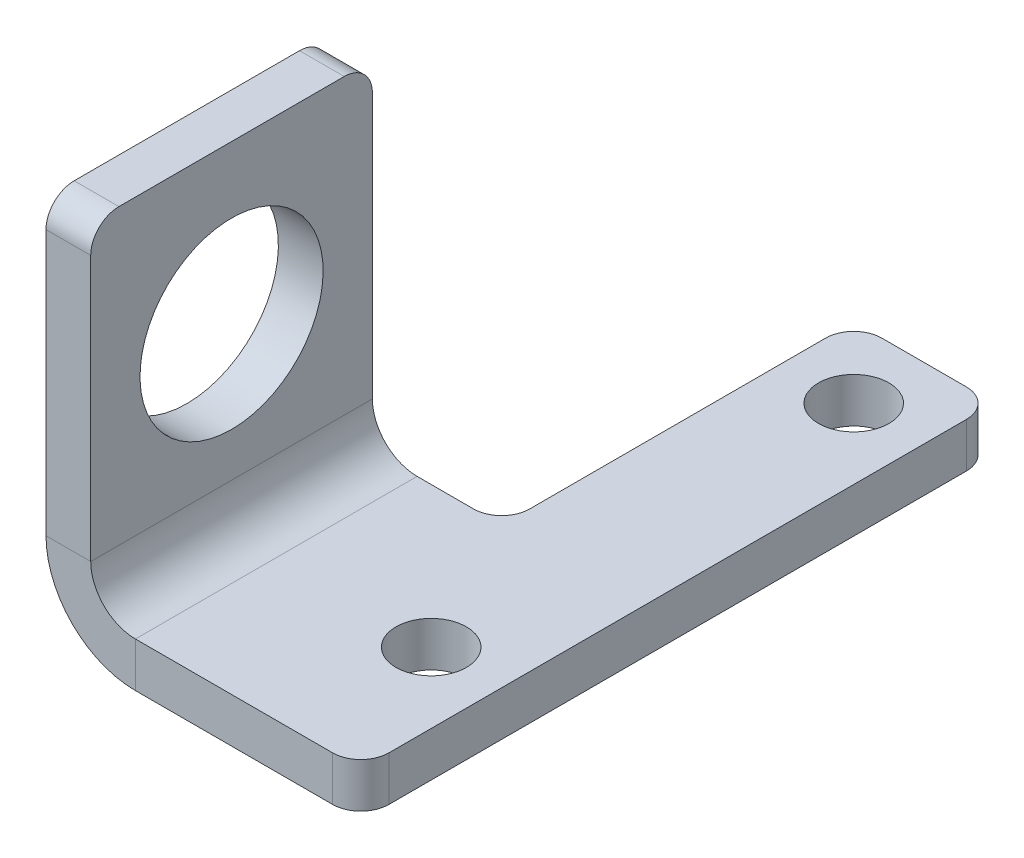
ISO-10303-21;
HEADER;
FILE_DESCRIPTION(('STEP AP214'),'2;1');
FILE_NAME('part.step','',(''),(''),'','','');
FILE_SCHEMA(('AUTOMOTIVE_DESIGN { 1 0 10303 214 1 1 1 1 }'));
ENDSEC;
DATA;
#1=APPLICATION_CONTEXT('core data for automotive mechanical design processes');
#2=APPLICATION_PROTOCOL_DEFINITION('international standard','automotive_design',2000,#1);
#3=PRODUCT_CONTEXT('',#1,'mechanical');
#4=PRODUCT('Part','Part','',(#3));
#5=PRODUCT_RELATED_PRODUCT_CATEGORY('part','',(#4));
#6=PRODUCT_DEFINITION_FORMATION('','',#4);
#7=PRODUCT_DEFINITION_CONTEXT('part definition',#1,'design');
#8=PRODUCT_DEFINITION('design','',#6,#7);
#9=PRODUCT_DEFINITION_SHAPE('','',#8);
#10=(LENGTH_UNIT() NAMED_UNIT(*) SI_UNIT(.MILLI.,.METRE.));
#11=(NAMED_UNIT(*) PLANE_ANGLE_UNIT() SI_UNIT($,.RADIAN.));
#12=(NAMED_UNIT(*) SI_UNIT($,.STERADIAN.) SOLID_ANGLE_UNIT());
#13=UNCERTAINTY_MEASURE_WITH_UNIT(LENGTH_MEASURE(1.E-05),#10,'distance_accuracy_value','');
#14=(GEOMETRIC_REPRESENTATION_CONTEXT(3) GLOBAL_UNCERTAINTY_ASSIGNED_CONTEXT((#13)) GLOBAL_UNIT_ASSIGNED_CONTEXT((#10,
#11,#12)) REPRESENTATION_CONTEXT('',''));
#15=CARTESIAN_POINT('',(0.,0.,0.));
#16=DIRECTION('',(0.,0.,1.));
#17=DIRECTION('',(1.,0.,0.));
#18=AXIS2_PLACEMENT_3D('',#15,#16,#17);
#19=CARTESIAN_POINT('',(-10.,3.175,0.));
#20=DIRECTION('',(1.,0.,0.));
#21=DIRECTION('',(0.,0.,-1.));
#22=AXIS2_PLACEMENT_3D('',#19,#20,#21);
#23=PLANE('',#22);
#24=DIRECTION('',(0.,0.,-1.));
#25=VECTOR('',#24,1.);
#26=CARTESIAN_POINT('',(-10.,0.,0.));
#27=LINE('',#26,#25);
#28=CARTESIAN_POINT('',(-10.,0.,-22.));
#29=VERTEX_POINT('',#28);
#30=CARTESIAN_POINT('',(-10.,0.,-43.));
#31=VERTEX_POINT('',#30);
#32=EDGE_CURVE('E249',#29,#31,#27,.T.);
#33=ORIENTED_EDGE('',*,*,#32,.F.);
#34=DIRECTION('',(0.,-1.,0.));
#35=VECTOR('',#34,1.);
#36=CARTESIAN_POINT('',(-10.,0.,-22.));
#37=LINE('',#36,#35);
#38=CARTESIAN_POINT('',(-10.,3.175,-22.));
#39=VERTEX_POINT('',#38);
#40=EDGE_CURVE('E277',#39,#29,#37,.T.);
#41=ORIENTED_EDGE('',*,*,#40,.F.);
#42=DIRECTION('',(0.,0.,-1.));
#43=VECTOR('',#42,1.);
#44=CARTESIAN_POINT('',(-10.,3.175,0.));
#45=LINE('',#44,#43);
#46=CARTESIAN_POINT('',(-10.,3.175,-43.));
#47=VERTEX_POINT('',#46);
#48=EDGE_CURVE('E231',#39,#47,#45,.T.);
#49=ORIENTED_EDGE('',*,*,#48,.T.);
#50=DIRECTION('',(0.,-1.,0.));
#51=VECTOR('',#50,1.);
#52=CARTESIAN_POINT('',(-10.,3.175,-43.));
#53=LINE('',#52,#51);
#54=EDGE_CURVE('E280',#31,#47,#53,.F.);
#55=ORIENTED_EDGE('',*,*,#54,.F.);
#56=EDGE_LOOP('',(#33,#41,#49,#55));
#57=FACE_BOUND('',#56,.T.);
#58=ADVANCED_FACE('F45',(#57),#23,.F.);
#59=CARTESIAN_POINT('',(0.,3.175,-45.));
#60=DIRECTION('',(0.,0.,1.));
#61=DIRECTION('',(1.,0.,0.));
#62=AXIS2_PLACEMENT_3D('',#59,#60,#61);
#63=PLANE('',#62);
#64=DIRECTION('',(-1.,0.,0.));
#65=VECTOR('',#64,1.);
#66=CARTESIAN_POINT('',(0.,0.,-45.));
#67=LINE('',#66,#65);
#68=CARTESIAN_POINT('',(-8.,0.,-45.));
#69=VERTEX_POINT('',#68);
#70=CARTESIAN_POINT('',(-2.,0.,-45.));
#71=VERTEX_POINT('',#70);
#72=EDGE_CURVE('E222',#69,#71,#67,.F.);
#73=ORIENTED_EDGE('',*,*,#72,.F.);
#74=DIRECTION('',(0.,-1.,0.));
#75=VECTOR('',#74,1.);
#76=CARTESIAN_POINT('',(-8.,3.175,-45.));
#77=LINE('',#76,#75);
#78=CARTESIAN_POINT('',(-8.,3.175,-45.));
#79=VERTEX_POINT('',#78);
#80=EDGE_CURVE('E237',#79,#69,#77,.T.);
#81=ORIENTED_EDGE('',*,*,#80,.F.);
#82=DIRECTION('',(1.,0.,0.));
#83=VECTOR('',#82,1.);
#84=CARTESIAN_POINT('',(0.,3.175,-45.));
#85=LINE('',#84,#83);
#86=CARTESIAN_POINT('',(-2.,3.175,-45.));
#87=VERTEX_POINT('',#86);
#88=EDGE_CURVE('E234',#79,#87,#85,.T.);
#89=ORIENTED_EDGE('',*,*,#88,.T.);
#90=DIRECTION('',(0.,-1.,0.));
#91=VECTOR('',#90,1.);
#92=CARTESIAN_POINT('',(-2.,3.175,-45.));
#93=LINE('',#92,#91);
#94=EDGE_CURVE('E256',#71,#87,#93,.F.);
#95=ORIENTED_EDGE('',*,*,#94,.F.);
#96=EDGE_LOOP('',(#73,#81,#89,#95));
#97=FACE_BOUND('',#96,.T.);
#98=ADVANCED_FACE('F327',(#97),#63,.F.);
#99=CARTESIAN_POINT('',(0.,3.175,0.));
#100=DIRECTION('',(-1.,0.,0.));
#101=DIRECTION('',(0.,0.,1.));
#102=AXIS2_PLACEMENT_3D('',#99,#100,#101);
#103=PLANE('',#102);
#104=DIRECTION('',(0.,0.,1.));
#105=VECTOR('',#104,1.);
#106=CARTESIAN_POINT('',(0.,3.175,0.));
#107=LINE('',#106,#105);
#108=CARTESIAN_POINT('',(0.,3.175,-43.));
#109=VERTEX_POINT('',#108);
#110=CARTESIAN_POINT('',(0.,3.175,-2.));
#111=VERTEX_POINT('',#110);
#112=EDGE_CURVE('E225',#109,#111,#107,.T.);
#113=ORIENTED_EDGE('',*,*,#112,.T.);
#114=DIRECTION('',(0.,-1.,0.));
#115=VECTOR('',#114,1.);
#116=CARTESIAN_POINT('',(0.,3.175,-2.));
#117=LINE('',#116,#115);
#118=CARTESIAN_POINT('',(0.,0.,-2.));
#119=VERTEX_POINT('',#118);
#120=EDGE_CURVE('E265',#119,#111,#117,.F.);
#121=ORIENTED_EDGE('',*,*,#120,.F.);
#122=DIRECTION('',(0.,0.,-1.));
#123=VECTOR('',#122,1.);
#124=CARTESIAN_POINT('',(0.,0.,0.));
#125=LINE('',#124,#123);
#126=CARTESIAN_POINT('',(0.,0.,-43.));
#127=VERTEX_POINT('',#126);
#128=EDGE_CURVE('E243',#127,#119,#125,.F.);
#129=ORIENTED_EDGE('',*,*,#128,.F.);
#130=DIRECTION('',(0.,-1.,0.));
#131=VECTOR('',#130,1.);
#132=CARTESIAN_POINT('',(0.,3.175,-43.));
#133=LINE('',#132,#131);
#134=EDGE_CURVE('E268',#109,#127,#133,.T.);
#135=ORIENTED_EDGE('',*,*,#134,.F.);
#136=EDGE_LOOP('',(#113,#121,#129,#135));
#137=FACE_BOUND('',#136,.T.);
#138=ADVANCED_FACE('F334',(#137),#103,.F.);
#139=CARTESIAN_POINT('',(-5.,3.175,-10.));
#140=DIRECTION('',(0.,-1.,0.));
#141=DIRECTION('',(0.,0.,-1.));
#142=AXIS2_PLACEMENT_3D('',#139,#140,#141);
#143=CYLINDRICAL_SURFACE('',#142,2.5);
#144=CARTESIAN_POINT('',(-5.,3.175,-10.));
#145=DIRECTION('',(0.,-1.,0.));
#146=DIRECTION('',(0.,0.,1.));
#147=AXIS2_PLACEMENT_3D('',#144,#145,#146);
#148=CIRCLE('',#147,2.5);
#149=CARTESIAN_POINT('',(-5.,3.175,-7.5));
#150=VERTEX_POINT('',#149);
#151=EDGE_CURVE('E218',#150,#150,#148,.T.);
#152=ORIENTED_EDGE('',*,*,#151,.F.);
#153=EDGE_LOOP('',(#152));
#154=FACE_BOUND('',#153,.T.);
#155=CARTESIAN_POINT('',(-5.,0.,-10.));
#156=DIRECTION('',(0.,-1.,0.));
#157=DIRECTION('',(0.,0.,1.));
#158=AXIS2_PLACEMENT_3D('',#155,#156,#157);
#159=CIRCLE('',#158,2.5);
#160=CARTESIAN_POINT('',(-5.,0.,-7.5));
#161=VERTEX_POINT('',#160);
#162=EDGE_CURVE('E217',#161,#161,#159,.T.);
#163=ORIENTED_EDGE('',*,*,#162,.T.);
#164=EDGE_LOOP('',(#163));
#165=FACE_BOUND('',#164,.T.);
#166=ADVANCED_FACE('F575',(#154,#165),#143,.F.);
#167=CARTESIAN_POINT('',(-5.,3.175,-40.));
#168=DIRECTION('',(0.,-1.,0.));
#169=DIRECTION('',(0.,0.,-1.));
#170=AXIS2_PLACEMENT_3D('',#167,#168,#169);
#171=CYLINDRICAL_SURFACE('',#170,2.5);
#172=CARTESIAN_POINT('',(-5.,3.175,-40.));
#173=DIRECTION('',(0.,-1.,0.));
#174=DIRECTION('',(0.,0.,1.));
#175=AXIS2_PLACEMENT_3D('',#172,#173,#174);
#176=CIRCLE('',#175,2.5);
#177=CARTESIAN_POINT('',(-5.,3.175,-37.5));
#178=VERTEX_POINT('',#177);
#179=EDGE_CURVE('E221',#178,#178,#176,.T.);
#180=ORIENTED_EDGE('',*,*,#179,.F.);
#181=EDGE_LOOP('',(#180));
#182=FACE_BOUND('',#181,.T.);
#183=CARTESIAN_POINT('',(-5.,0.,-40.));
#184=DIRECTION('',(0.,-1.,0.));
#185=DIRECTION('',(0.,0.,1.));
#186=AXIS2_PLACEMENT_3D('',#183,#184,#185);
#187=CIRCLE('',#186,2.5);
#188=CARTESIAN_POINT('',(-5.,0.,-37.5));
#189=VERTEX_POINT('',#188);
#190=EDGE_CURVE('E240',#189,#189,#187,.T.);
#191=ORIENTED_EDGE('',*,*,#190,.T.);
#192=EDGE_LOOP('',(#191));
#193=FACE_BOUND('',#192,.T.);
#194=ADVANCED_FACE('F396',(#182,#193),#171,.F.);
#195=CARTESIAN_POINT('',(0.,3.175,0.));
#196=DIRECTION('',(0.,0.,-1.));
#197=DIRECTION('',(-1.,0.,0.));
#198=AXIS2_PLACEMENT_3D('',#195,#196,#197);
#199=PLANE('',#198);
#200=DIRECTION('',(-1.,0.,0.));
#201=VECTOR('',#200,1.);
#202=CARTESIAN_POINT('',(0.,3.175,0.));
#203=LINE('',#202,#201);
#204=CARTESIAN_POINT('',(-2.,3.175,0.));
#205=VERTEX_POINT('',#204);
#206=CARTESIAN_POINT('',(-16.,3.175,0.));
#207=VERTEX_POINT('',#206);
#208=EDGE_CURVE('E228',#205,#207,#203,.T.);
#209=ORIENTED_EDGE('',*,*,#208,.T.);
#210=DIRECTION('',(0.,-1.,0.));
#211=VECTOR('',#210,1.);
#212=CARTESIAN_POINT('',(-16.,3.175,0.));
#213=LINE('',#212,#211);
#214=CARTESIAN_POINT('',(-16.,0.,0.));
#215=VERTEX_POINT('',#214);
#216=EDGE_CURVE('E207',#207,#215,#213,.T.);
#217=ORIENTED_EDGE('',*,*,#216,.T.);
#218=DIRECTION('',(-1.,0.,0.));
#219=VECTOR('',#218,1.);
#220=CARTESIAN_POINT('',(0.,0.,0.));
#221=LINE('',#220,#219);
#222=CARTESIAN_POINT('',(-2.,0.,0.));
#223=VERTEX_POINT('',#222);
#224=EDGE_CURVE('E246',#223,#215,#221,.T.);
#225=ORIENTED_EDGE('',*,*,#224,.F.);
#226=DIRECTION('',(0.,-1.,0.));
#227=VECTOR('',#226,1.);
#228=CARTESIAN_POINT('',(-2.,3.175,0.));
#229=LINE('',#228,#227);
#230=EDGE_CURVE('E300',#205,#223,#229,.T.);
#231=ORIENTED_EDGE('',*,*,#230,.F.);
#232=EDGE_LOOP('',(#209,#217,#225,#231));
#233=FACE_BOUND('',#232,.T.);
#234=ADVANCED_FACE('F341',(#233),#199,.F.);
#235=CARTESIAN_POINT('',(0.,3.175,0.));
#236=DIRECTION('',(0.,-1.,0.));
#237=DIRECTION('',(0.,0.,-1.));
#238=AXIS2_PLACEMENT_3D('',#235,#236,#237);
#239=PLANE('',#238);
#240=ORIENTED_EDGE('',*,*,#151,.T.);
#241=EDGE_LOOP('',(#240));
#242=FACE_BOUND('',#241,.T.);
#243=ORIENTED_EDGE('',*,*,#179,.T.);
#244=EDGE_LOOP('',(#243));
#245=FACE_BOUND('',#244,.T.);
#246=ORIENTED_EDGE('',*,*,#88,.F.);
#247=CARTESIAN_POINT('',(-8.,3.175,-43.));
#248=DIRECTION('',(0.,1.,0.));
#249=DIRECTION('',(0.,0.,-1.));
#250=AXIS2_PLACEMENT_3D('',#247,#248,#249);
#251=CIRCLE('',#250,2.);
#252=EDGE_CURVE('E261',#47,#79,#251,.F.);
#253=ORIENTED_EDGE('',*,*,#252,.F.);
#254=ORIENTED_EDGE('',*,*,#48,.F.);
#255=CARTESIAN_POINT('',(-12.,3.175,-22.));
#256=DIRECTION('',(0.,1.,0.));
#257=DIRECTION('',(0.,0.,-1.));
#258=AXIS2_PLACEMENT_3D('',#255,#256,#257);
#259=CIRCLE('',#258,2.);
#260=CARTESIAN_POINT('',(-12.,3.175,-20.));
#261=VERTEX_POINT('',#260);
#262=EDGE_CURVE('E11',#261,#39,#259,.T.);
#263=ORIENTED_EDGE('',*,*,#262,.F.);
#264=DIRECTION('',(1.,0.,0.));
#265=VECTOR('',#264,1.);
#266=CARTESIAN_POINT('',(-16.,3.175,-20.));
#267=LINE('',#266,#265);
#268=CARTESIAN_POINT('',(-16.,3.175,-20.));
#269=VERTEX_POINT('',#268);
#270=EDGE_CURVE('E214',#269,#261,#267,.T.);
#271=ORIENTED_EDGE('',*,*,#270,.F.);
#272=DIRECTION('',(0.,0.,-1.));
#273=VECTOR('',#272,1.);
#274=CARTESIAN_POINT('',(-16.,3.175,-20.));
#275=LINE('',#274,#273);
#276=EDGE_CURVE('E198',#269,#207,#275,.F.);
#277=ORIENTED_EDGE('',*,*,#276,.T.);
#278=ORIENTED_EDGE('',*,*,#208,.F.);
#279=CARTESIAN_POINT('',(-2.,3.175,-2.));
#280=DIRECTION('',(0.,1.,0.));
#281=DIRECTION('',(0.,0.,-1.));
#282=AXIS2_PLACEMENT_3D('',#279,#280,#281);
#283=CIRCLE('',#282,2.);
#284=EDGE_CURVE('E259',#111,#205,#283,.F.);
#285=ORIENTED_EDGE('',*,*,#284,.F.);
#286=ORIENTED_EDGE('',*,*,#112,.F.);
#287=CARTESIAN_POINT('',(-2.,3.175,-43.));
#288=DIRECTION('',(0.,1.,0.));
#289=DIRECTION('',(0.,0.,-1.));
#290=AXIS2_PLACEMENT_3D('',#287,#288,#289);
#291=CIRCLE('',#290,2.);
#292=EDGE_CURVE('E263',#87,#109,#291,.F.);
#293=ORIENTED_EDGE('',*,*,#292,.F.);
#294=EDGE_LOOP('',(#246,#253,#254,#263,#271,#277,#278,#285,#286,#293));
#295=FACE_BOUND('',#294,.T.);
#296=ADVANCED_FACE('F318',(#242,#245,#295),#239,.F.);
#297=CARTESIAN_POINT('',(0.,0.,0.));
#298=DIRECTION('',(0.,-1.,0.));
#299=DIRECTION('',(0.,0.,-1.));
#300=AXIS2_PLACEMENT_3D('',#297,#298,#299);
#301=PLANE('',#300);
#302=ORIENTED_EDGE('',*,*,#162,.F.);
#303=EDGE_LOOP('',(#302));
#304=FACE_BOUND('',#303,.T.);
#305=ORIENTED_EDGE('',*,*,#190,.F.);
#306=EDGE_LOOP('',(#305));
#307=FACE_BOUND('',#306,.T.);
#308=ORIENTED_EDGE('',*,*,#128,.T.);
#309=CARTESIAN_POINT('',(-2.,0.,-2.));
#310=DIRECTION('',(0.,1.,0.));
#311=DIRECTION('',(0.,0.,-1.));
#312=AXIS2_PLACEMENT_3D('',#309,#310,#311);
#313=CIRCLE('',#312,2.);
#314=EDGE_CURVE('E271',#223,#119,#313,.T.);
#315=ORIENTED_EDGE('',*,*,#314,.F.);
#316=ORIENTED_EDGE('',*,*,#224,.T.);
#317=DIRECTION('',(0.,0.,-1.));
#318=VECTOR('',#317,1.);
#319=CARTESIAN_POINT('',(-16.,0.,-20.));
#320=LINE('',#319,#318);
#321=CARTESIAN_POINT('',(-16.,0.,-20.));
#322=VERTEX_POINT('',#321);
#323=EDGE_CURVE('E193',#322,#215,#320,.F.);
#324=ORIENTED_EDGE('',*,*,#323,.F.);
#325=DIRECTION('',(1.,0.,0.));
#326=VECTOR('',#325,1.);
#327=CARTESIAN_POINT('',(-16.,0.,-20.));
#328=LINE('',#327,#326);
#329=CARTESIAN_POINT('',(-12.,0.,-20.));
#330=VERTEX_POINT('',#329);
#331=EDGE_CURVE('E210',#322,#330,#328,.T.);
#332=ORIENTED_EDGE('',*,*,#331,.T.);
#333=CARTESIAN_POINT('',(-12.,0.,-22.));
#334=DIRECTION('',(0.,1.,0.));
#335=DIRECTION('',(0.,0.,-1.));
#336=AXIS2_PLACEMENT_3D('',#333,#334,#335);
#337=CIRCLE('',#336,2.);
#338=EDGE_CURVE('E53',#29,#330,#337,.F.);
#339=ORIENTED_EDGE('',*,*,#338,.F.);
#340=ORIENTED_EDGE('',*,*,#32,.T.);
#341=CARTESIAN_POINT('',(-8.,0.,-43.));
#342=DIRECTION('',(0.,1.,0.));
#343=DIRECTION('',(0.,0.,-1.));
#344=AXIS2_PLACEMENT_3D('',#341,#342,#343);
#345=CIRCLE('',#344,2.);
#346=EDGE_CURVE('E273',#69,#31,#345,.T.);
#347=ORIENTED_EDGE('',*,*,#346,.F.);
#348=ORIENTED_EDGE('',*,*,#72,.T.);
#349=CARTESIAN_POINT('',(-2.,0.,-43.));
#350=DIRECTION('',(0.,1.,0.));
#351=DIRECTION('',(0.,0.,-1.));
#352=AXIS2_PLACEMENT_3D('',#349,#350,#351);
#353=CIRCLE('',#352,2.);
#354=EDGE_CURVE('E275',#127,#71,#353,.T.);
#355=ORIENTED_EDGE('',*,*,#354,.F.);
#356=EDGE_LOOP('',(#308,#315,#316,#324,#332,#339,#340,#347,#348,#355));
#357=FACE_BOUND('',#356,.T.);
#358=ADVANCED_FACE('F309',(#304,#307,#357),#301,.T.);
#359=CARTESIAN_POINT('',(-16.,3.175,-20.));
#360=DIRECTION('',(0.,0.,-1.));
#361=DIRECTION('',(0.,-1.,0.));
#362=AXIS2_PLACEMENT_3D('',#359,#360,#361);
#363=PLANE('',#362);
#364=ORIENTED_EDGE('',*,*,#331,.F.);
#365=DIRECTION('',(0.,-1.,0.));
#366=VECTOR('',#365,1.);
#367=CARTESIAN_POINT('',(-16.,3.175,-20.));
#368=LINE('',#367,#366);
#369=EDGE_CURVE('E191',#269,#322,#368,.T.);
#370=ORIENTED_EDGE('',*,*,#369,.F.);
#371=ORIENTED_EDGE('',*,*,#270,.T.);
#372=DIRECTION('',(0.,1.,0.));
#373=VECTOR('',#372,1.);
#374=CARTESIAN_POINT('',(-12.,3.175,-20.));
#375=LINE('',#374,#373);
#376=EDGE_CURVE('E283',#330,#261,#375,.T.);
#377=ORIENTED_EDGE('',*,*,#376,.F.);
#378=EDGE_LOOP('',(#364,#370,#371,#377));
#379=FACE_BOUND('',#378,.T.);
#380=ADVANCED_FACE('F311',(#379),#363,.T.);
#381=CARTESIAN_POINT('',(-16.,6.35,0.));
#382=DIRECTION('',(0.,0.,1.));
#383=DIRECTION('',(0.,-1.,0.));
#384=AXIS2_PLACEMENT_3D('',#381,#382,#383);
#385=PLANE('',#384);
#386=DIRECTION('',(1.,0.,0.));
#387=VECTOR('',#386,1.);
#388=CARTESIAN_POINT('',(-22.35,6.34999999999998,0.));
#389=LINE('',#388,#387);
#390=CARTESIAN_POINT('',(-19.175,6.34999999999999,0.));
#391=VERTEX_POINT('',#390);
#392=CARTESIAN_POINT('',(-22.35,6.34999999999997,0.));
#393=VERTEX_POINT('',#392);
#394=EDGE_CURVE('E346',#391,#393,#389,.F.);
#395=ORIENTED_EDGE('',*,*,#394,.T.);
#396=CARTESIAN_POINT('',(-16.,6.35,0.));
#397=DIRECTION('',(0.,0.,1.));
#398=DIRECTION('',(0.,1.,0.));
#399=AXIS2_PLACEMENT_3D('',#396,#397,#398);
#400=CIRCLE('',#399,6.35);
#401=EDGE_CURVE('E176',#215,#393,#400,.F.);
#402=ORIENTED_EDGE('',*,*,#401,.F.);
#403=ORIENTED_EDGE('',*,*,#216,.F.);
#404=CARTESIAN_POINT('',(-16.,6.35,0.));
#405=DIRECTION('',(0.,0.,1.));
#406=DIRECTION('',(0.,1.,0.));
#407=AXIS2_PLACEMENT_3D('',#404,#405,#406);
#408=CIRCLE('',#407,3.175);
#409=EDGE_CURVE('E194',#207,#391,#408,.F.);
#410=ORIENTED_EDGE('',*,*,#409,.T.);
#411=EDGE_LOOP('',(#395,#402,#403,#410));
#412=FACE_BOUND('',#411,.T.);
#413=ADVANCED_FACE('F344',(#412),#385,.T.);
#414=CARTESIAN_POINT('',(-16.,6.35,-20.));
#415=DIRECTION('',(0.,0.,1.));
#416=DIRECTION('',(0.,-1.,0.));
#417=AXIS2_PLACEMENT_3D('',#414,#415,#416);
#418=PLANE('',#417);
#419=CARTESIAN_POINT('',(-16.,6.35,-20.));
#420=DIRECTION('',(0.,0.,1.));
#421=DIRECTION('',(0.,1.,0.));
#422=AXIS2_PLACEMENT_3D('',#419,#420,#421);
#423=CIRCLE('',#422,3.175);
#424=CARTESIAN_POINT('',(-19.175,6.34999999999999,-20.));
#425=VERTEX_POINT('',#424);
#426=EDGE_CURVE('E204',#425,#269,#423,.T.);
#427=ORIENTED_EDGE('',*,*,#426,.T.);
#428=ORIENTED_EDGE('',*,*,#369,.T.);
#429=CARTESIAN_POINT('',(-16.,6.35,-20.));
#430=DIRECTION('',(0.,0.,1.));
#431=DIRECTION('',(0.,1.,0.));
#432=AXIS2_PLACEMENT_3D('',#429,#430,#431);
#433=CIRCLE('',#432,6.35);
#434=CARTESIAN_POINT('',(-22.35,6.34999999999998,-20.));
#435=VERTEX_POINT('',#434);
#436=EDGE_CURVE('E174',#435,#322,#433,.T.);
#437=ORIENTED_EDGE('',*,*,#436,.F.);
#438=DIRECTION('',(1.,0.,0.));
#439=VECTOR('',#438,1.);
#440=CARTESIAN_POINT('',(-19.175,6.34999999999999,-20.));
#441=LINE('',#440,#439);
#442=EDGE_CURVE('E179',#425,#435,#441,.F.);
#443=ORIENTED_EDGE('',*,*,#442,.F.);
#444=EDGE_LOOP('',(#427,#428,#437,#443));
#445=FACE_BOUND('',#444,.T.);
#446=ADVANCED_FACE('F189',(#445),#418,.F.);
#447=CARTESIAN_POINT('',(-16.,6.35,-20.));
#448=DIRECTION('',(0.,0.,-1.));
#449=DIRECTION('',(-1.,0.,0.));
#450=AXIS2_PLACEMENT_3D('',#447,#448,#449);
#451=CYLINDRICAL_SURFACE('',#450,6.35);
#452=ORIENTED_EDGE('',*,*,#323,.T.);
#453=ORIENTED_EDGE('',*,*,#401,.T.);
#454=DIRECTION('',(0.,0.,-1.));
#455=VECTOR('',#454,1.);
#456=CARTESIAN_POINT('',(-22.35,6.34999999999998,0.));
#457=LINE('',#456,#455);
#458=EDGE_CURVE('E162',#435,#393,#457,.F.);
#459=ORIENTED_EDGE('',*,*,#458,.F.);
#460=ORIENTED_EDGE('',*,*,#436,.T.);
#461=EDGE_LOOP('',(#452,#453,#459,#460));
#462=FACE_BOUND('',#461,.T.);
#463=ADVANCED_FACE('F172',(#462),#451,.T.);
#464=CARTESIAN_POINT('',(-16.,6.35,-20.));
#465=DIRECTION('',(0.,0.,-1.));
#466=DIRECTION('',(-1.,0.,0.));
#467=AXIS2_PLACEMENT_3D('',#464,#465,#466);
#468=CYLINDRICAL_SURFACE('',#467,3.175);
#469=ORIENTED_EDGE('',*,*,#276,.F.);
#470=ORIENTED_EDGE('',*,*,#426,.F.);
#471=DIRECTION('',(0.,0.,-1.));
#472=VECTOR('',#471,1.);
#473=CARTESIAN_POINT('',(-19.175,6.34999999999999,0.));
#474=LINE('',#473,#472);
#475=EDGE_CURVE('E187',#391,#425,#474,.T.);
#476=ORIENTED_EDGE('',*,*,#475,.F.);
#477=ORIENTED_EDGE('',*,*,#409,.F.);
#478=EDGE_LOOP('',(#469,#470,#476,#477));
#479=FACE_BOUND('',#478,.T.);
#480=ADVANCED_FACE('F492',(#479),#468,.F.);
#481=CARTESIAN_POINT('',(-22.3500000000001,27.175,-20.));
#482=DIRECTION('',(0.,0.,1.));
#483=DIRECTION('',(0.,-1.,0.));
#484=AXIS2_PLACEMENT_3D('',#481,#482,#483);
#485=PLANE('',#484);
#486=DIRECTION('',(0.,-1.,0.));
#487=VECTOR('',#486,1.);
#488=CARTESIAN_POINT('',(-19.1750000000001,27.175,-20.));
#489=LINE('',#488,#487);
#490=CARTESIAN_POINT('',(-19.1750000000001,25.175,-20.));
#491=VERTEX_POINT('',#490);
#492=EDGE_CURVE('E178',#425,#491,#489,.F.);
#493=ORIENTED_EDGE('',*,*,#492,.F.);
#494=ORIENTED_EDGE('',*,*,#442,.T.);
#495=DIRECTION('',(0.,1.,0.));
#496=VECTOR('',#495,1.);
#497=CARTESIAN_POINT('',(-22.35,0.,-20.));
#498=LINE('',#497,#496);
#499=CARTESIAN_POINT('',(-22.3500000000001,25.175,-20.));
#500=VERTEX_POINT('',#499);
#501=EDGE_CURVE('E158',#435,#500,#498,.T.);
#502=ORIENTED_EDGE('',*,*,#501,.T.);
#503=DIRECTION('',(1.,0.,0.));
#504=VECTOR('',#503,1.);
#505=CARTESIAN_POINT('',(-22.3500000000001,25.175,-20.));
#506=LINE('',#505,#504);
#507=EDGE_CURVE('E294',#491,#500,#506,.F.);
#508=ORIENTED_EDGE('',*,*,#507,.F.);
#509=EDGE_LOOP('',(#493,#494,#502,#508));
#510=FACE_BOUND('',#509,.T.);
#511=ADVANCED_FACE('F182',(#510),#485,.F.);
#512=CARTESIAN_POINT('',(-22.35,3.17499999999999,0.));
#513=DIRECTION('',(0.,0.,-1.));
#514=DIRECTION('',(1.,0.,0.));
#515=AXIS2_PLACEMENT_3D('',#512,#513,#514);
#516=PLANE('',#515);
#517=DIRECTION('',(0.,-1.,0.));
#518=VECTOR('',#517,1.);
#519=CARTESIAN_POINT('',(-22.35,0.,0.));
#520=LINE('',#519,#518);
#521=CARTESIAN_POINT('',(-22.3500000000001,25.175,0.));
#522=VERTEX_POINT('',#521);
#523=EDGE_CURVE('E206',#522,#393,#520,.T.);
#524=ORIENTED_EDGE('',*,*,#523,.T.);
#525=ORIENTED_EDGE('',*,*,#394,.F.);
#526=DIRECTION('',(0.,1.,0.));
#527=VECTOR('',#526,1.);
#528=CARTESIAN_POINT('',(-19.175,3.175,0.));
#529=LINE('',#528,#527);
#530=CARTESIAN_POINT('',(-19.1750000000001,25.175,0.));
#531=VERTEX_POINT('',#530);
#532=EDGE_CURVE('E168',#531,#391,#529,.F.);
#533=ORIENTED_EDGE('',*,*,#532,.F.);
#534=DIRECTION('',(1.,0.,0.));
#535=VECTOR('',#534,1.);
#536=CARTESIAN_POINT('',(-22.3500000000001,25.175,0.));
#537=LINE('',#536,#535);
#538=EDGE_CURVE('E298',#522,#531,#537,.T.);
#539=ORIENTED_EDGE('',*,*,#538,.F.);
#540=EDGE_LOOP('',(#524,#525,#533,#539));
#541=FACE_BOUND('',#540,.T.);
#542=ADVANCED_FACE('F378',(#541),#516,.F.);
#543=CARTESIAN_POINT('',(-22.35,0.,0.));
#544=DIRECTION('',(1.,0.,0.));
#545=DIRECTION('',(0.,-1.,0.));
#546=AXIS2_PLACEMENT_3D('',#543,#544,#545);
#547=PLANE('',#546);
#548=CARTESIAN_POINT('',(-22.35,15.9699999999999,-10.));
#549=DIRECTION('',(-1.,0.,0.));
#550=DIRECTION('',(0.,-1.,0.));
#551=AXIS2_PLACEMENT_3D('',#548,#549,#550);
#552=CIRCLE('',#551,6.5);
#553=CARTESIAN_POINT('',(-22.35,9.46999999999992,-10.));
#554=VERTEX_POINT('',#553);
#555=EDGE_CURVE('E349',#554,#554,#552,.F.);
#556=ORIENTED_EDGE('',*,*,#555,.T.);
#557=EDGE_LOOP('',(#556));
#558=FACE_BOUND('',#557,.T.);
#559=ORIENTED_EDGE('',*,*,#501,.F.);
#560=ORIENTED_EDGE('',*,*,#458,.T.);
#561=ORIENTED_EDGE('',*,*,#523,.F.);
#562=CARTESIAN_POINT('',(-22.3500000000001,25.175,-2.));
#563=DIRECTION('',(-1.,0.,0.));
#564=DIRECTION('',(0.,-1.,0.));
#565=AXIS2_PLACEMENT_3D('',#562,#563,#564);
#566=CIRCLE('',#565,2.);
#567=CARTESIAN_POINT('',(-22.3500000000001,27.175,-2.));
#568=VERTEX_POINT('',#567);
#569=EDGE_CURVE('E60',#568,#522,#566,.F.);
#570=ORIENTED_EDGE('',*,*,#569,.F.);
#571=DIRECTION('',(0.,0.,1.));
#572=VECTOR('',#571,1.);
#573=CARTESIAN_POINT('',(-22.3500000000001,27.175,0.));
#574=LINE('',#573,#572);
#575=CARTESIAN_POINT('',(-22.3500000000001,27.175,-18.));
#576=VERTEX_POINT('',#575);
#577=EDGE_CURVE('E167',#576,#568,#574,.T.);
#578=ORIENTED_EDGE('',*,*,#577,.F.);
#579=CARTESIAN_POINT('',(-22.3500000000001,25.175,-18.));
#580=DIRECTION('',(-1.,0.,0.));
#581=DIRECTION('',(0.,-1.,0.));
#582=AXIS2_PLACEMENT_3D('',#579,#580,#581);
#583=CIRCLE('',#582,2.);
#584=EDGE_CURVE('E68',#500,#576,#583,.F.);
#585=ORIENTED_EDGE('',*,*,#584,.F.);
#586=EDGE_LOOP('',(#559,#560,#561,#570,#578,#585));
#587=FACE_BOUND('',#586,.T.);
#588=ADVANCED_FACE('F160',(#558,#587),#547,.F.);
#589=CARTESIAN_POINT('',(-19.175,0.,0.));
#590=DIRECTION('',(1.,0.,0.));
#591=DIRECTION('',(0.,-1.,0.));
#592=AXIS2_PLACEMENT_3D('',#589,#590,#591);
#593=PLANE('',#592);
#594=CARTESIAN_POINT('',(-19.175,15.9699999999999,-10.));
#595=DIRECTION('',(-1.,0.,0.));
#596=DIRECTION('',(0.,-1.,0.));
#597=AXIS2_PLACEMENT_3D('',#594,#595,#596);
#598=CIRCLE('',#597,6.5);
#599=CARTESIAN_POINT('',(-19.175,9.46999999999993,-10.));
#600=VERTEX_POINT('',#599);
#601=EDGE_CURVE('E353',#600,#600,#598,.T.);
#602=ORIENTED_EDGE('',*,*,#601,.T.);
#603=EDGE_LOOP('',(#602));
#604=FACE_BOUND('',#603,.T.);
#605=DIRECTION('',(0.,0.,-1.));
#606=VECTOR('',#605,1.);
#607=CARTESIAN_POINT('',(-19.1750000000001,27.175,0.));
#608=LINE('',#607,#606);
#609=CARTESIAN_POINT('',(-19.1750000000001,27.175,-18.));
#610=VERTEX_POINT('',#609);
#611=CARTESIAN_POINT('',(-19.1750000000001,27.175,-2.));
#612=VERTEX_POINT('',#611);
#613=EDGE_CURVE('E357',#610,#612,#608,.F.);
#614=ORIENTED_EDGE('',*,*,#613,.T.);
#615=CARTESIAN_POINT('',(-19.1750000000001,25.175,-2.));
#616=DIRECTION('',(-1.,0.,0.));
#617=DIRECTION('',(0.,-1.,0.));
#618=AXIS2_PLACEMENT_3D('',#615,#616,#617);
#619=CIRCLE('',#618,2.);
#620=EDGE_CURVE('E289',#531,#612,#619,.T.);
#621=ORIENTED_EDGE('',*,*,#620,.F.);
#622=ORIENTED_EDGE('',*,*,#532,.T.);
#623=ORIENTED_EDGE('',*,*,#475,.T.);
#624=ORIENTED_EDGE('',*,*,#492,.T.);
#625=CARTESIAN_POINT('',(-19.1750000000001,25.175,-18.));
#626=DIRECTION('',(-1.,0.,0.));
#627=DIRECTION('',(0.,-1.,0.));
#628=AXIS2_PLACEMENT_3D('',#625,#626,#627);
#629=CIRCLE('',#628,2.);
#630=EDGE_CURVE('E292',#610,#491,#629,.T.);
#631=ORIENTED_EDGE('',*,*,#630,.F.);
#632=EDGE_LOOP('',(#614,#621,#622,#623,#624,#631));
#633=FACE_BOUND('',#632,.T.);
#634=ADVANCED_FACE('F367',(#604,#633),#593,.T.);
#635=CARTESIAN_POINT('',(-22.3500000000001,27.175,0.));
#636=DIRECTION('',(0.,-1.,0.));
#637=DIRECTION('',(-1.,0.,0.));
#638=AXIS2_PLACEMENT_3D('',#635,#636,#637);
#639=PLANE('',#638);
#640=ORIENTED_EDGE('',*,*,#577,.T.);
#641=DIRECTION('',(1.,0.,0.));
#642=VECTOR('',#641,1.);
#643=CARTESIAN_POINT('',(-22.3500000000001,27.175,-2.));
#644=LINE('',#643,#642);
#645=EDGE_CURVE('E285',#612,#568,#644,.F.);
#646=ORIENTED_EDGE('',*,*,#645,.F.);
#647=ORIENTED_EDGE('',*,*,#613,.F.);
#648=DIRECTION('',(1.,0.,0.));
#649=VECTOR('',#648,1.);
#650=CARTESIAN_POINT('',(-22.3500000000001,27.175,-18.));
#651=LINE('',#650,#649);
#652=EDGE_CURVE('E287',#576,#610,#651,.T.);
#653=ORIENTED_EDGE('',*,*,#652,.F.);
#654=EDGE_LOOP('',(#640,#646,#647,#653));
#655=FACE_BOUND('',#654,.T.);
#656=ADVANCED_FACE('F373',(#655),#639,.F.);
#657=CARTESIAN_POINT('',(-22.3510000000001,15.9699999999999,-10.));
#658=DIRECTION('',(1.,0.,0.));
#659=DIRECTION('',(0.,-1.,0.));
#660=AXIS2_PLACEMENT_3D('',#657,#658,#659);
#661=CYLINDRICAL_SURFACE('',#660,6.5);
#662=CARTESIAN_POINT('',(-19.175,9.46999999999993,-10.));
#663=CARTESIAN_POINT('',(-19.2080729166667,9.46999999999993,-10.));
#664=CARTESIAN_POINT('',(-19.2411458333333,9.46999999999993,-10.));
#665=CARTESIAN_POINT('',(-19.3072916666667,9.46999999999993,-10.));
#666=CARTESIAN_POINT('',(-19.3403645833333,9.46999999999993,-10.));
#667=CARTESIAN_POINT('',(-19.4065104166667,9.46999999999993,-10.));
#668=CARTESIAN_POINT('',(-19.4395833333333,9.46999999999993,-10.));
#669=CARTESIAN_POINT('',(-19.5057291666667,9.46999999999993,-10.));
#670=CARTESIAN_POINT('',(-19.5388020833333,9.46999999999993,-10.));
#671=CARTESIAN_POINT('',(-19.6049479166667,9.46999999999993,-10.));
#672=CARTESIAN_POINT('',(-19.6380208333333,9.46999999999993,-10.));
#673=CARTESIAN_POINT('',(-19.7041666666667,9.46999999999993,-10.));
#674=CARTESIAN_POINT('',(-19.7372395833333,9.46999999999993,-10.));
#675=CARTESIAN_POINT('',(-19.8033854166667,9.46999999999993,-10.));
#676=CARTESIAN_POINT('',(-19.8364583333333,9.46999999999993,-10.));
#677=CARTESIAN_POINT('',(-19.9026041666667,9.46999999999993,-10.));
#678=CARTESIAN_POINT('',(-19.9356770833333,9.46999999999993,-10.));
#679=CARTESIAN_POINT('',(-20.0018229166667,9.46999999999993,-10.));
#680=CARTESIAN_POINT('',(-20.0348958333333,9.46999999999993,-10.));
#681=CARTESIAN_POINT('',(-20.1010416666667,9.46999999999993,-10.));
#682=CARTESIAN_POINT('',(-20.1341145833333,9.46999999999993,-10.));
#683=CARTESIAN_POINT('',(-20.2002604166667,9.46999999999993,-10.));
#684=CARTESIAN_POINT('',(-20.2333333333333,9.46999999999993,-10.));
#685=CARTESIAN_POINT('',(-20.2994791666667,9.46999999999993,-10.));
#686=CARTESIAN_POINT('',(-20.3325520833333,9.46999999999993,-10.));
#687=CARTESIAN_POINT('',(-20.3986979166667,9.46999999999993,-10.));
#688=CARTESIAN_POINT('',(-20.4317708333333,9.46999999999993,-10.));
#689=CARTESIAN_POINT('',(-20.4979166666667,9.46999999999993,-10.));
#690=CARTESIAN_POINT('',(-20.5309895833333,9.46999999999993,-10.));
#691=CARTESIAN_POINT('',(-20.5971354166667,9.46999999999993,-10.));
#692=CARTESIAN_POINT('',(-20.6302083333333,9.46999999999993,-10.));
#693=CARTESIAN_POINT('',(-20.6963541666667,9.46999999999993,-10.));
#694=CARTESIAN_POINT('',(-20.7294270833333,9.46999999999993,-10.));
#695=CARTESIAN_POINT('',(-20.7955729166667,9.46999999999993,-10.));
#696=CARTESIAN_POINT('',(-20.8286458333333,9.46999999999993,-10.));
#697=CARTESIAN_POINT('',(-20.8947916666667,9.46999999999993,-10.));
#698=CARTESIAN_POINT('',(-20.9278645833333,9.46999999999993,-10.));
#699=CARTESIAN_POINT('',(-20.9940104166667,9.46999999999993,-10.));
#700=CARTESIAN_POINT('',(-21.0270833333333,9.46999999999993,-10.));
#701=CARTESIAN_POINT('',(-21.0932291666667,9.46999999999993,-10.));
#702=CARTESIAN_POINT('',(-21.1263020833333,9.46999999999993,-10.));
#703=CARTESIAN_POINT('',(-21.1924479166667,9.46999999999993,-10.));
#704=CARTESIAN_POINT('',(-21.2255208333333,9.46999999999993,-10.));
#705=CARTESIAN_POINT('',(-21.2916666666667,9.46999999999993,-10.));
#706=CARTESIAN_POINT('',(-21.3247395833333,9.46999999999993,-10.));
#707=CARTESIAN_POINT('',(-21.3908854166667,9.46999999999993,-10.));
#708=CARTESIAN_POINT('',(-21.4239583333333,9.46999999999993,-10.));
#709=CARTESIAN_POINT('',(-21.4901041666667,9.46999999999993,-10.));
#710=CARTESIAN_POINT('',(-21.5231770833333,9.46999999999993,-10.));
#711=CARTESIAN_POINT('',(-21.5893229166667,9.46999999999993,-10.));
#712=CARTESIAN_POINT('',(-21.6223958333333,9.46999999999992,-10.));
#713=CARTESIAN_POINT('',(-21.6885416666667,9.46999999999992,-10.));
#714=CARTESIAN_POINT('',(-21.7216145833333,9.46999999999992,-10.));
#715=CARTESIAN_POINT('',(-21.7877604166667,9.46999999999992,-10.));
#716=CARTESIAN_POINT('',(-21.8208333333333,9.46999999999992,-10.));
#717=CARTESIAN_POINT('',(-21.8869791666667,9.46999999999992,-10.));
#718=CARTESIAN_POINT('',(-21.9200520833333,9.46999999999992,-10.));
#719=CARTESIAN_POINT('',(-21.9861979166667,9.46999999999992,-10.));
#720=CARTESIAN_POINT('',(-22.0192708333333,9.46999999999992,-10.));
#721=CARTESIAN_POINT('',(-22.0854166666667,9.46999999999992,-10.));
#722=CARTESIAN_POINT('',(-22.1184895833333,9.46999999999992,-10.));
#723=CARTESIAN_POINT('',(-22.1846354166667,9.46999999999992,-10.));
#724=CARTESIAN_POINT('',(-22.2177083333333,9.46999999999992,-10.));
#725=CARTESIAN_POINT('',(-22.2838541666667,9.46999999999992,-10.));
#726=CARTESIAN_POINT('',(-22.3169270833333,9.46999999999992,-10.));
#727=CARTESIAN_POINT('',(-22.35,9.46999999999992,-10.));
#728=B_SPLINE_CURVE_WITH_KNOTS('',3,(#662,#663,#664,#665,#666,#667,#668,#669,#670,#671,#672,
#673,#674,#675,#676,#677,#678,#679,#680,#681,#682,#683,#684,#685,#686,#687,#688,#689,#690,#691,
#692,#693,#694,#695,#696,#697,#698,#699,#700,#701,#702,#703,#704,#705,#706,#707,#708,#709,#710,
#711,#712,#713,#714,#715,#716,#717,#718,#719,#720,#721,#722,#723,#724,#725,#726,#727),
.UNSPECIFIED.,.F.,.F.,(4,2,2,2,2,2,2,2,2,2,2,2,2,2,2,2,2,2,2,2,2,2,2,2,2,2,2,2,2,2,2,2,4),(0.,
0.0992187500000012,0.198437500000002,0.29765625,0.396875000000001,0.496093750000003,0.5953125,
0.694531250000002,0.793750000000003,0.892968750000001,0.992187500000002,1.09140625,1.190625,
1.28984375,1.3890625,1.48828125,1.5875,1.68671875,1.7859375,1.88515625,1.984375,2.08359375,
2.1828125,2.28203125,2.38125,2.48046875,2.5796875,2.67890625,2.778125,2.87734375,2.9765625,
3.07578125,3.175),.UNSPECIFIED.);
#729=EDGE_CURVE('BSEAM370',#600,#554,#728,.T.);
#730=ORIENTED_EDGE('',*,*,#601,.F.);
#731=ORIENTED_EDGE('',*,*,#555,.F.);
#732=ORIENTED_EDGE('',*,*,#729,.T.);
#733=ORIENTED_EDGE('',*,*,#729,.F.);
#734=EDGE_LOOP('',(#730,#732,#731,#733));
#735=FACE_BOUND('',#734,.T.);
#736=ADVANCED_FACE('F370',(#735),#661,.F.);
#737=CARTESIAN_POINT('',(-2.,3.175,-43.));
#738=DIRECTION('',(0.,1.,0.));
#739=DIRECTION('',(0.,0.,1.));
#740=AXIS2_PLACEMENT_3D('',#737,#738,#739);
#741=CYLINDRICAL_SURFACE('',#740,2.);
#742=ORIENTED_EDGE('',*,*,#354,.T.);
#743=ORIENTED_EDGE('',*,*,#94,.T.);
#744=ORIENTED_EDGE('',*,*,#292,.T.);
#745=ORIENTED_EDGE('',*,*,#134,.T.);
#746=EDGE_LOOP('',(#742,#743,#744,#745));
#747=FACE_BOUND('',#746,.T.);
#748=ADVANCED_FACE('F329',(#747),#741,.T.);
#749=CARTESIAN_POINT('',(-8.,3.175,-43.));
#750=DIRECTION('',(0.,1.,0.));
#751=DIRECTION('',(0.,0.,1.));
#752=AXIS2_PLACEMENT_3D('',#749,#750,#751);
#753=CYLINDRICAL_SURFACE('',#752,2.);
#754=ORIENTED_EDGE('',*,*,#346,.T.);
#755=ORIENTED_EDGE('',*,*,#54,.T.);
#756=ORIENTED_EDGE('',*,*,#252,.T.);
#757=ORIENTED_EDGE('',*,*,#80,.T.);
#758=EDGE_LOOP('',(#754,#755,#756,#757));
#759=FACE_BOUND('',#758,.T.);
#760=ADVANCED_FACE('F324',(#759),#753,.T.);
#761=CARTESIAN_POINT('',(-12.,3.175,-22.));
#762=DIRECTION('',(0.,-1.,0.));
#763=DIRECTION('',(0.,0.,-1.));
#764=AXIS2_PLACEMENT_3D('',#761,#762,#763);
#765=CYLINDRICAL_SURFACE('',#764,2.);
#766=ORIENTED_EDGE('',*,*,#262,.T.);
#767=ORIENTED_EDGE('',*,*,#40,.T.);
#768=ORIENTED_EDGE('',*,*,#338,.T.);
#769=ORIENTED_EDGE('',*,*,#376,.T.);
#770=EDGE_LOOP('',(#766,#767,#768,#769));
#771=FACE_BOUND('',#770,.T.);
#772=ADVANCED_FACE('F304',(#771),#765,.F.);
#773=CARTESIAN_POINT('',(-22.3500000000001,25.175,-18.));
#774=DIRECTION('',(1.,0.,0.));
#775=DIRECTION('',(0.,-1.,0.));
#776=AXIS2_PLACEMENT_3D('',#773,#774,#775);
#777=CYLINDRICAL_SURFACE('',#776,2.);
#778=ORIENTED_EDGE('',*,*,#584,.T.);
#779=ORIENTED_EDGE('',*,*,#652,.T.);
#780=ORIENTED_EDGE('',*,*,#630,.T.);
#781=ORIENTED_EDGE('',*,*,#507,.T.);
#782=EDGE_LOOP('',(#778,#779,#780,#781));
#783=FACE_BOUND('',#782,.T.);
#784=ADVANCED_FACE('F403',(#783),#777,.T.);
#785=CARTESIAN_POINT('',(-22.3500000000001,25.175,-2.));
#786=DIRECTION('',(1.,0.,0.));
#787=DIRECTION('',(0.,-1.,0.));
#788=AXIS2_PLACEMENT_3D('',#785,#786,#787);
#789=CYLINDRICAL_SURFACE('',#788,2.);
#790=ORIENTED_EDGE('',*,*,#569,.T.);
#791=ORIENTED_EDGE('',*,*,#538,.T.);
#792=ORIENTED_EDGE('',*,*,#620,.T.);
#793=ORIENTED_EDGE('',*,*,#645,.T.);
#794=EDGE_LOOP('',(#790,#791,#792,#793));
#795=FACE_BOUND('',#794,.T.);
#796=ADVANCED_FACE('F405',(#795),#789,.T.);
#797=CARTESIAN_POINT('',(-2.,3.175,-2.));
#798=DIRECTION('',(0.,1.,0.));
#799=DIRECTION('',(0.,0.,1.));
#800=AXIS2_PLACEMENT_3D('',#797,#798,#799);
#801=CYLINDRICAL_SURFACE('',#800,2.);
#802=ORIENTED_EDGE('',*,*,#314,.T.);
#803=ORIENTED_EDGE('',*,*,#120,.T.);
#804=ORIENTED_EDGE('',*,*,#284,.T.);
#805=ORIENTED_EDGE('',*,*,#230,.T.);
#806=EDGE_LOOP('',(#802,#803,#804,#805));
#807=FACE_BOUND('',#806,.T.);
#808=ADVANCED_FACE('F47',(#807),#801,.T.);
#809=CLOSED_SHELL('',(#58,#98,#138,#166,#194,#234,#296,#358,#380,#413,#446,#463,#480,#511,#542,
#588,#634,#656,#736,#748,#760,#772,#784,#796,#808));
#810=MANIFOLD_SOLID_BREP('B2',#809);
#811=ADVANCED_BREP_SHAPE_REPRESENTATION('',(#18,#810),#14);
#812=SHAPE_DEFINITION_REPRESENTATION(#9,#811);
ENDSEC;
END-ISO-10303-21;
